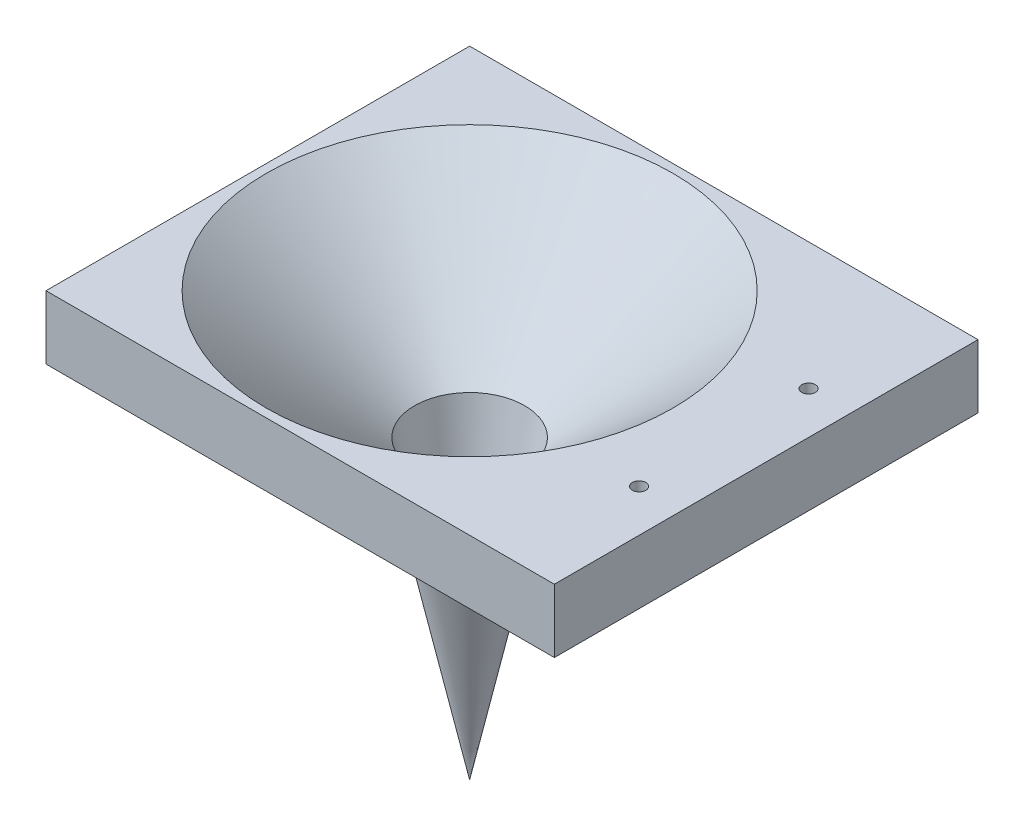
ISO-10303-21;
HEADER;
FILE_DESCRIPTION(('STEP AP214'),'2;1');
FILE_NAME('part.step','',(''),(''),'','','');
FILE_SCHEMA(('AUTOMOTIVE_DESIGN { 1 0 10303 214 1 1 1 1 }'));
ENDSEC;
DATA;
#1=APPLICATION_CONTEXT('core data for automotive mechanical design processes');
#2=APPLICATION_PROTOCOL_DEFINITION('international standard','automotive_design',2000,#1);
#3=PRODUCT_CONTEXT('',#1,'mechanical');
#4=PRODUCT('Part','Part','',(#3));
#5=PRODUCT_RELATED_PRODUCT_CATEGORY('part','',(#4));
#6=PRODUCT_DEFINITION_FORMATION('','',#4);
#7=PRODUCT_DEFINITION_CONTEXT('part definition',#1,'design');
#8=PRODUCT_DEFINITION('design','',#6,#7);
#9=PRODUCT_DEFINITION_SHAPE('','',#8);
#10=(LENGTH_UNIT() NAMED_UNIT(*) SI_UNIT(.MILLI.,.METRE.));
#11=(NAMED_UNIT(*) PLANE_ANGLE_UNIT() SI_UNIT($,.RADIAN.));
#12=(NAMED_UNIT(*) SI_UNIT($,.STERADIAN.) SOLID_ANGLE_UNIT());
#13=UNCERTAINTY_MEASURE_WITH_UNIT(LENGTH_MEASURE(1.E-05),#10,'distance_accuracy_value','');
#14=(GEOMETRIC_REPRESENTATION_CONTEXT(3) GLOBAL_UNCERTAINTY_ASSIGNED_CONTEXT((#13)) GLOBAL_UNIT_ASSIGNED_CONTEXT((#10,
#11,#12)) REPRESENTATION_CONTEXT('',''));
#15=CARTESIAN_POINT('',(0.,0.,0.));
#16=DIRECTION('',(0.,0.,1.));
#17=DIRECTION('',(1.,0.,0.));
#18=AXIS2_PLACEMENT_3D('',#15,#16,#17);
#19=CARTESIAN_POINT('',(0.,14.6761992917921,0.));
#20=DIRECTION('',(0.,1.,0.));
#21=DIRECTION('',(0.,0.,1.));
#22=AXIS2_PLACEMENT_3D('',#19,#20,#21);
#23=CONICAL_SURFACE('',#22,13.,0.862170054667226);
#24=CARTESIAN_POINT('',(0.,44.6761992917921,0.));
#25=DIRECTION('',(0.,-1.,0.));
#26=DIRECTION('',(0.,0.,-1.));
#27=AXIS2_PLACEMENT_3D('',#24,#25,#26);
#28=CIRCLE('',#27,48.);
#29=CARTESIAN_POINT('',(0.,44.6761992917921,48.));
#30=VERTEX_POINT('',#29);
#31=EDGE_CURVE('E124',#30,#30,#28,.T.);
#32=CARTESIAN_POINT('',(0.,14.6761992917921,0.));
#33=DIRECTION('',(0.,-1.,0.));
#34=DIRECTION('',(0.,0.,-1.));
#35=AXIS2_PLACEMENT_3D('',#32,#33,#34);
#36=CIRCLE('',#35,13.);
#37=CARTESIAN_POINT('',(0.,14.6761992917921,13.));
#38=VERTEX_POINT('',#37);
#39=EDGE_CURVE('E11',#38,#38,#36,.T.);
#40=CARTESIAN_POINT('',(0.,44.6761992917921,48.));
#41=CARTESIAN_POINT('',(0.,44.3636992917921,47.6354166666667));
#42=CARTESIAN_POINT('',(0.,44.0511992917921,47.2708333333333));
#43=CARTESIAN_POINT('',(0.,43.4261992917921,46.5416666666667));
#44=CARTESIAN_POINT('',(0.,43.1136992917921,46.1770833333333));
#45=CARTESIAN_POINT('',(0.,42.4886992917921,45.4479166666667));
#46=CARTESIAN_POINT('',(0.,42.1761992917921,45.0833333333333));
#47=CARTESIAN_POINT('',(0.,41.5511992917921,44.3541666666667));
#48=CARTESIAN_POINT('',(0.,41.2386992917921,43.9895833333333));
#49=CARTESIAN_POINT('',(0.,40.6136992917921,43.2604166666667));
#50=CARTESIAN_POINT('',(0.,40.3011992917921,42.8958333333333));
#51=CARTESIAN_POINT('',(0.,39.6761992917921,42.1666666666667));
#52=CARTESIAN_POINT('',(0.,39.3636992917921,41.8020833333333));
#53=CARTESIAN_POINT('',(0.,38.7386992917921,41.0729166666667));
#54=CARTESIAN_POINT('',(0.,38.4261992917921,40.7083333333333));
#55=CARTESIAN_POINT('',(0.,37.8011992917921,39.9791666666667));
#56=CARTESIAN_POINT('',(0.,37.4886992917921,39.6145833333333));
#57=CARTESIAN_POINT('',(0.,36.8636992917921,38.8854166666667));
#58=CARTESIAN_POINT('',(0.,36.5511992917921,38.5208333333333));
#59=CARTESIAN_POINT('',(0.,35.9261992917921,37.7916666666667));
#60=CARTESIAN_POINT('',(0.,35.6136992917921,37.4270833333333));
#61=CARTESIAN_POINT('',(0.,34.9886992917921,36.6979166666667));
#62=CARTESIAN_POINT('',(0.,34.6761992917921,36.3333333333333));
#63=CARTESIAN_POINT('',(0.,34.0511992917921,35.6041666666667));
#64=CARTESIAN_POINT('',(0.,33.7386992917921,35.2395833333333));
#65=CARTESIAN_POINT('',(0.,33.1136992917921,34.5104166666667));
#66=CARTESIAN_POINT('',(0.,32.8011992917921,34.1458333333333));
#67=CARTESIAN_POINT('',(0.,32.1761992917921,33.4166666666667));
#68=CARTESIAN_POINT('',(0.,31.8636992917921,33.0520833333333));
#69=CARTESIAN_POINT('',(0.,31.2386992917921,32.3229166666667));
#70=CARTESIAN_POINT('',(0.,30.9261992917921,31.9583333333333));
#71=CARTESIAN_POINT('',(0.,30.3011992917921,31.2291666666667));
#72=CARTESIAN_POINT('',(0.,29.9886992917921,30.8645833333333));
#73=CARTESIAN_POINT('',(0.,29.3636992917921,30.1354166666667));
#74=CARTESIAN_POINT('',(0.,29.0511992917921,29.7708333333333));
#75=CARTESIAN_POINT('',(0.,28.4261992917921,29.0416666666667));
#76=CARTESIAN_POINT('',(0.,28.1136992917921,28.6770833333333));
#77=CARTESIAN_POINT('',(0.,27.4886992917921,27.9479166666667));
#78=CARTESIAN_POINT('',(0.,27.1761992917921,27.5833333333333));
#79=CARTESIAN_POINT('',(0.,26.5511992917921,26.8541666666667));
#80=CARTESIAN_POINT('',(0.,26.2386992917921,26.4895833333333));
#81=CARTESIAN_POINT('',(0.,25.6136992917921,25.7604166666667));
#82=CARTESIAN_POINT('',(0.,25.3011992917921,25.3958333333333));
#83=CARTESIAN_POINT('',(0.,24.6761992917921,24.6666666666667));
#84=CARTESIAN_POINT('',(0.,24.3636992917921,24.3020833333333));
#85=CARTESIAN_POINT('',(0.,23.7386992917921,23.5729166666667));
#86=CARTESIAN_POINT('',(0.,23.4261992917921,23.2083333333333));
#87=CARTESIAN_POINT('',(0.,22.8011992917921,22.4791666666667));
#88=CARTESIAN_POINT('',(0.,22.4886992917921,22.1145833333333));
#89=CARTESIAN_POINT('',(0.,21.8636992917921,21.3854166666667));
#90=CARTESIAN_POINT('',(0.,21.5511992917921,21.0208333333333));
#91=CARTESIAN_POINT('',(0.,20.9261992917921,20.2916666666667));
#92=CARTESIAN_POINT('',(0.,20.6136992917921,19.9270833333333));
#93=CARTESIAN_POINT('',(0.,19.9886992917921,19.1979166666667));
#94=CARTESIAN_POINT('',(0.,19.6761992917921,18.8333333333333));
#95=CARTESIAN_POINT('',(0.,19.0511992917921,18.1041666666667));
#96=CARTESIAN_POINT('',(0.,18.7386992917921,17.7395833333333));
#97=CARTESIAN_POINT('',(0.,18.1136992917921,17.0104166666667));
#98=CARTESIAN_POINT('',(0.,17.8011992917921,16.6458333333333));
#99=CARTESIAN_POINT('',(0.,17.1761992917921,15.9166666666667));
#100=CARTESIAN_POINT('',(0.,16.8636992917921,15.5520833333333));
#101=CARTESIAN_POINT('',(0.,16.2386992917921,14.8229166666667));
#102=CARTESIAN_POINT('',(0.,15.9261992917921,14.4583333333333));
#103=CARTESIAN_POINT('',(0.,15.3011992917921,13.7291666666667));
#104=CARTESIAN_POINT('',(0.,14.9886992917921,13.3645833333333));
#105=CARTESIAN_POINT('',(0.,14.6761992917921,13.));
#106=B_SPLINE_CURVE_WITH_KNOTS('',3,(#40,#41,#42,#43,#44,#45,#46,#47,#48,#49,#50,#51,#52,#53,
#54,#55,#56,#57,#58,#59,#60,#61,#62,#63,#64,#65,#66,#67,#68,#69,#70,#71,#72,#73,#74,#75,#76,#77,
#78,#79,#80,#81,#82,#83,#84,#85,#86,#87,#88,#89,#90,#91,#92,#93,#94,#95,#96,#97,#98,#99,#100,
#101,#102,#103,#104,#105),.UNSPECIFIED.,.F.,.F.,(4,2,2,2,2,2,2,2,2,2,2,2,2,2,2,2,2,2,2,2,2,2,2,
2,2,2,2,2,2,2,2,2,4),(0.,1.44055382145202,2.88110764290403,4.32166146435604,5.76221528580806,
7.20276910726006,8.64332292871208,10.0838767501641,11.5244305716161,12.9649843930681,
14.4055382145201,15.8460920359721,17.2866458574242,18.7271996788762,20.1677535003282,
21.6083073217802,23.0488611432322,24.4894149646842,25.9299687861362,27.3705226075883,
28.8110764290403,30.2516302504923,31.6921840719443,33.1327378933963,34.5732917148483,
36.0138455363003,37.4543993577524,38.8949531792044,40.3355070006564,41.7760608221084,
43.2166146435604,44.6571684650124,46.0977222864644),.UNSPECIFIED.);
#107=EDGE_CURVE('BSEAM47',#30,#38,#106,.T.);
#108=ORIENTED_EDGE('',*,*,#31,.F.);
#109=ORIENTED_EDGE('',*,*,#39,.T.);
#110=ORIENTED_EDGE('',*,*,#107,.T.);
#111=ORIENTED_EDGE('',*,*,#107,.F.);
#112=EDGE_LOOP('',(#108,#110,#109,#111));
#113=FACE_BOUND('',#112,.T.);
#114=ADVANCED_FACE('F47',(#113),#23,.F.);
#115=CARTESIAN_POINT('',(0.,-53.3238007082079,0.));
#116=DIRECTION('',(0.,1.,0.));
#117=DIRECTION('',(0.,0.,1.));
#118=AXIS2_PLACEMENT_3D('',#115,#116,#117);
#119=CONICAL_SURFACE('',#118,0.,0.188897180877623);
#120=ORIENTED_EDGE('',*,*,#39,.F.);
#121=EDGE_LOOP('',(#120));
#122=FACE_BOUND('',#121,.T.);
#123=CARTESIAN_POINT('',(0.,-53.3238007082079,0.));
#124=VERTEX_POINT('',#123);
#125=VERTEX_LOOP('',#124);
#126=FACE_BOUND('',#125,.T.);
#127=ADVANCED_FACE('F194',(#122,#126),#119,.F.);
#128=CARTESIAN_POINT('',(-3.10003406915555E-13,44.6761992917921,0.));
#129=DIRECTION('',(0.,-1.,0.));
#130=DIRECTION('',(0.,0.,-1.));
#131=AXIS2_PLACEMENT_3D('',#128,#129,#130);
#132=PLANE('',#131);
#133=CARTESIAN_POINT('',(60.,44.6761992917921,-20.));
#134=DIRECTION('',(0.,1.,0.));
#135=DIRECTION('',(0.,0.,1.));
#136=AXIS2_PLACEMENT_3D('',#133,#134,#135);
#137=CIRCLE('',#136,1.6);
#138=CARTESIAN_POINT('',(60.,44.6761992917921,-18.4));
#139=VERTEX_POINT('',#138);
#140=EDGE_CURVE('E138',#139,#139,#137,.T.);
#141=ORIENTED_EDGE('',*,*,#140,.F.);
#142=EDGE_LOOP('',(#141));
#143=FACE_BOUND('',#142,.T.);
#144=CARTESIAN_POINT('',(60.,44.6761992917921,20.));
#145=DIRECTION('',(0.,1.,0.));
#146=DIRECTION('',(0.,0.,1.));
#147=AXIS2_PLACEMENT_3D('',#144,#145,#146);
#148=CIRCLE('',#147,1.6);
#149=CARTESIAN_POINT('',(60.,44.6761992917921,21.6));
#150=VERTEX_POINT('',#149);
#151=EDGE_CURVE('E145',#150,#150,#148,.T.);
#152=ORIENTED_EDGE('',*,*,#151,.F.);
#153=EDGE_LOOP('',(#152));
#154=FACE_BOUND('',#153,.T.);
#155=DIRECTION('',(0.,0.,-1.));
#156=VECTOR('',#155,1.);
#157=CARTESIAN_POINT('',(70.,44.6761992917921,50.));
#158=LINE('',#157,#156);
#159=CARTESIAN_POINT('',(70.,44.6761992917921,50.));
#160=VERTEX_POINT('',#159);
#161=CARTESIAN_POINT('',(70.,44.6761992917921,-50.));
#162=VERTEX_POINT('',#161);
#163=EDGE_CURVE('E117',#160,#162,#158,.T.);
#164=ORIENTED_EDGE('',*,*,#163,.T.);
#165=DIRECTION('',(1.,0.,0.));
#166=VECTOR('',#165,1.);
#167=CARTESIAN_POINT('',(-50.001,44.6761992917921,-50.));
#168=LINE('',#167,#166);
#169=CARTESIAN_POINT('',(-50.001,44.6761992917921,-50.));
#170=VERTEX_POINT('',#169);
#171=EDGE_CURVE('E94',#170,#162,#168,.T.);
#172=ORIENTED_EDGE('',*,*,#171,.F.);
#173=DIRECTION('',(0.,0.,-1.));
#174=VECTOR('',#173,1.);
#175=CARTESIAN_POINT('',(-50.001,44.6761992917921,50.));
#176=LINE('',#175,#174);
#177=CARTESIAN_POINT('',(-50.001,44.6761992917921,50.));
#178=VERTEX_POINT('',#177);
#179=EDGE_CURVE('E102',#178,#170,#176,.T.);
#180=ORIENTED_EDGE('',*,*,#179,.F.);
#181=DIRECTION('',(1.,0.,0.));
#182=VECTOR('',#181,1.);
#183=CARTESIAN_POINT('',(-50.001,44.6761992917921,50.));
#184=LINE('',#183,#182);
#185=EDGE_CURVE('E157',#178,#160,#184,.T.);
#186=ORIENTED_EDGE('',*,*,#185,.T.);
#187=EDGE_LOOP('',(#164,#172,#180,#186));
#188=FACE_BOUND('',#187,.T.);
#189=ORIENTED_EDGE('',*,*,#31,.T.);
#190=EDGE_LOOP('',(#189));
#191=FACE_BOUND('',#190,.T.);
#192=ADVANCED_FACE('F114',(#143,#154,#188,#191),#132,.F.);
#193=CARTESIAN_POINT('',(-50.001,29.6761992917921,50.));
#194=DIRECTION('',(0.,-1.,0.));
#195=DIRECTION('',(0.,0.,-1.));
#196=AXIS2_PLACEMENT_3D('',#193,#194,#195);
#197=PLANE('',#196);
#198=CARTESIAN_POINT('',(60.,29.6761992917921,-20.));
#199=DIRECTION('',(0.,-1.,0.));
#200=DIRECTION('',(0.,0.,-1.));
#201=AXIS2_PLACEMENT_3D('',#198,#199,#200);
#202=CIRCLE('',#201,1.6);
#203=CARTESIAN_POINT('',(60.,29.6761992917921,-21.6));
#204=VERTEX_POINT('',#203);
#205=EDGE_CURVE('E50',#204,#204,#202,.T.);
#206=ORIENTED_EDGE('',*,*,#205,.F.);
#207=EDGE_LOOP('',(#206));
#208=FACE_BOUND('',#207,.T.);
#209=CARTESIAN_POINT('',(60.,29.6761992917921,20.));
#210=DIRECTION('',(0.,-1.,0.));
#211=DIRECTION('',(0.,0.,-1.));
#212=AXIS2_PLACEMENT_3D('',#209,#210,#211);
#213=CIRCLE('',#212,1.6);
#214=CARTESIAN_POINT('',(60.,29.6761992917921,18.4));
#215=VERTEX_POINT('',#214);
#216=EDGE_CURVE('E135',#215,#215,#213,.T.);
#217=ORIENTED_EDGE('',*,*,#216,.F.);
#218=EDGE_LOOP('',(#217));
#219=FACE_BOUND('',#218,.T.);
#220=DIRECTION('',(0.,0.,-1.));
#221=VECTOR('',#220,1.);
#222=CARTESIAN_POINT('',(70.,29.6761992917921,50.));
#223=LINE('',#222,#221);
#224=CARTESIAN_POINT('',(70.,29.6761992917921,50.));
#225=VERTEX_POINT('',#224);
#226=CARTESIAN_POINT('',(70.,29.6761992917921,-50.));
#227=VERTEX_POINT('',#226);
#228=EDGE_CURVE('E163',#225,#227,#223,.T.);
#229=ORIENTED_EDGE('',*,*,#228,.F.);
#230=DIRECTION('',(1.,0.,0.));
#231=VECTOR('',#230,1.);
#232=CARTESIAN_POINT('',(-50.001,29.6761992917921,50.));
#233=LINE('',#232,#231);
#234=CARTESIAN_POINT('',(-50.001,29.6761992917921,50.));
#235=VERTEX_POINT('',#234);
#236=EDGE_CURVE('E126',#235,#225,#233,.T.);
#237=ORIENTED_EDGE('',*,*,#236,.F.);
#238=DIRECTION('',(0.,0.,-1.));
#239=VECTOR('',#238,1.);
#240=CARTESIAN_POINT('',(-50.001,29.6761992917921,50.));
#241=LINE('',#240,#239);
#242=CARTESIAN_POINT('',(-50.001,29.6761992917921,-50.));
#243=VERTEX_POINT('',#242);
#244=EDGE_CURVE('E101',#235,#243,#241,.T.);
#245=ORIENTED_EDGE('',*,*,#244,.T.);
#246=DIRECTION('',(1.,0.,0.));
#247=VECTOR('',#246,1.);
#248=CARTESIAN_POINT('',(-50.001,29.6761992917921,-50.));
#249=LINE('',#248,#247);
#250=EDGE_CURVE('E96',#243,#227,#249,.T.);
#251=ORIENTED_EDGE('',*,*,#250,.T.);
#252=EDGE_LOOP('',(#229,#237,#245,#251));
#253=FACE_BOUND('',#252,.T.);
#254=CARTESIAN_POINT('',(0.,29.6761992917921,0.));
#255=DIRECTION('',(0.,-1.,0.));
#256=DIRECTION('',(0.,0.,-1.));
#257=AXIS2_PLACEMENT_3D('',#254,#255,#256);
#258=CIRCLE('',#257,32.5);
#259=CARTESIAN_POINT('',(0.,29.6761992917921,-32.5));
#260=VERTEX_POINT('',#259);
#261=EDGE_CURVE('E119',#260,#260,#258,.F.);
#262=ORIENTED_EDGE('',*,*,#261,.T.);
#263=EDGE_LOOP('',(#262));
#264=FACE_BOUND('',#263,.T.);
#265=ADVANCED_FACE('F177',(#208,#219,#253,#264),#197,.T.);
#266=CARTESIAN_POINT('',(-50.001,44.6761992917921,-50.));
#267=DIRECTION('',(0.,0.,1.));
#268=DIRECTION('',(1.,0.,0.));
#269=AXIS2_PLACEMENT_3D('',#266,#267,#268);
#270=PLANE('',#269);
#271=DIRECTION('',(0.,-1.,0.));
#272=VECTOR('',#271,1.);
#273=CARTESIAN_POINT('',(70.,44.6761992917921,-50.));
#274=LINE('',#273,#272);
#275=EDGE_CURVE('E160',#162,#227,#274,.T.);
#276=ORIENTED_EDGE('',*,*,#275,.T.);
#277=ORIENTED_EDGE('',*,*,#250,.F.);
#278=DIRECTION('',(0.,-1.,0.));
#279=VECTOR('',#278,1.);
#280=CARTESIAN_POINT('',(-50.001,44.6761992917921,-50.));
#281=LINE('',#280,#279);
#282=EDGE_CURVE('E89',#170,#243,#281,.T.);
#283=ORIENTED_EDGE('',*,*,#282,.F.);
#284=ORIENTED_EDGE('',*,*,#171,.T.);
#285=EDGE_LOOP('',(#276,#277,#283,#284));
#286=FACE_BOUND('',#285,.T.);
#287=ADVANCED_FACE('F92',(#286),#270,.F.);
#288=CARTESIAN_POINT('',(-50.001,44.6761992917921,50.));
#289=DIRECTION('',(0.,0.,1.));
#290=DIRECTION('',(1.,0.,0.));
#291=AXIS2_PLACEMENT_3D('',#288,#289,#290);
#292=PLANE('',#291);
#293=DIRECTION('',(0.,-1.,0.));
#294=VECTOR('',#293,1.);
#295=CARTESIAN_POINT('',(70.,44.6761992917921,50.));
#296=LINE('',#295,#294);
#297=EDGE_CURVE('E111',#160,#225,#296,.T.);
#298=ORIENTED_EDGE('',*,*,#297,.F.);
#299=ORIENTED_EDGE('',*,*,#185,.F.);
#300=DIRECTION('',(0.,-1.,0.));
#301=VECTOR('',#300,1.);
#302=CARTESIAN_POINT('',(-50.001,44.6761992917921,50.));
#303=LINE('',#302,#301);
#304=EDGE_CURVE('E108',#178,#235,#303,.T.);
#305=ORIENTED_EDGE('',*,*,#304,.T.);
#306=ORIENTED_EDGE('',*,*,#236,.T.);
#307=EDGE_LOOP('',(#298,#299,#305,#306));
#308=FACE_BOUND('',#307,.T.);
#309=ADVANCED_FACE('F175',(#308),#292,.T.);
#310=CARTESIAN_POINT('',(-50.001,0.,0.));
#311=DIRECTION('',(-1.,0.,0.));
#312=DIRECTION('',(0.,0.,1.));
#313=AXIS2_PLACEMENT_3D('',#310,#311,#312);
#314=PLANE('',#313);
#315=ORIENTED_EDGE('',*,*,#179,.T.);
#316=ORIENTED_EDGE('',*,*,#282,.T.);
#317=ORIENTED_EDGE('',*,*,#244,.F.);
#318=ORIENTED_EDGE('',*,*,#304,.F.);
#319=EDGE_LOOP('',(#315,#316,#317,#318));
#320=FACE_BOUND('',#319,.T.);
#321=ADVANCED_FACE('F106',(#320),#314,.T.);
#322=CARTESIAN_POINT('',(70.,0.,0.));
#323=DIRECTION('',(-1.,0.,0.));
#324=DIRECTION('',(0.,0.,1.));
#325=AXIS2_PLACEMENT_3D('',#322,#323,#324);
#326=PLANE('',#325);
#327=ORIENTED_EDGE('',*,*,#163,.F.);
#328=ORIENTED_EDGE('',*,*,#297,.T.);
#329=ORIENTED_EDGE('',*,*,#228,.T.);
#330=ORIENTED_EDGE('',*,*,#275,.F.);
#331=EDGE_LOOP('',(#327,#328,#329,#330));
#332=FACE_BOUND('',#331,.T.);
#333=ADVANCED_FACE('F180',(#332),#326,.F.);
#334=CARTESIAN_POINT('',(0.,14.6761992917921,0.));
#335=DIRECTION('',(0.,1.,0.));
#336=DIRECTION('',(0.,0.,1.));
#337=AXIS2_PLACEMENT_3D('',#334,#335,#336);
#338=CONICAL_SURFACE('',#337,15.,0.211093333222747);
#339=CARTESIAN_POINT('',(0.,-55.3238007082079,0.));
#340=VERTEX_POINT('',#339);
#341=VERTEX_LOOP('',#340);
#342=FACE_BOUND('',#341,.T.);
#343=CARTESIAN_POINT('',(0.,14.6761992917921,0.));
#344=DIRECTION('',(0.,-1.,0.));
#345=DIRECTION('',(0.,0.,-1.));
#346=AXIS2_PLACEMENT_3D('',#343,#344,#345);
#347=CIRCLE('',#346,15.);
#348=CARTESIAN_POINT('',(0.,14.6761992917921,-15.));
#349=VERTEX_POINT('',#348);
#350=EDGE_CURVE('E56',#349,#349,#347,.T.);
#351=ORIENTED_EDGE('',*,*,#350,.T.);
#352=EDGE_LOOP('',(#351));
#353=FACE_BOUND('',#352,.T.);
#354=ADVANCED_FACE('F182',(#342,#353),#338,.T.);
#355=CARTESIAN_POINT('',(0.,44.6761992917921,0.));
#356=DIRECTION('',(0.,1.,0.));
#357=DIRECTION('',(0.,0.,1.));
#358=AXIS2_PLACEMENT_3D('',#355,#356,#357);
#359=CONICAL_SURFACE('',#358,50.,0.862170054667226);
#360=ORIENTED_EDGE('',*,*,#261,.F.);
#361=EDGE_LOOP('',(#360));
#362=FACE_BOUND('',#361,.T.);
#363=ORIENTED_EDGE('',*,*,#350,.F.);
#364=EDGE_LOOP('',(#363));
#365=FACE_BOUND('',#364,.T.);
#366=ADVANCED_FACE('F189',(#362,#365),#359,.T.);
#367=CARTESIAN_POINT('',(60.,-55.3238007082079,20.));
#368=DIRECTION('',(0.,1.,0.));
#369=DIRECTION('',(0.,0.,1.));
#370=AXIS2_PLACEMENT_3D('',#367,#368,#369);
#371=CYLINDRICAL_SURFACE('',#370,1.6);
#372=ORIENTED_EDGE('',*,*,#216,.T.);
#373=EDGE_LOOP('',(#372));
#374=FACE_BOUND('',#373,.T.);
#375=ORIENTED_EDGE('',*,*,#151,.T.);
#376=EDGE_LOOP('',(#375));
#377=FACE_BOUND('',#376,.T.);
#378=ADVANCED_FACE('F214',(#374,#377),#371,.F.);
#379=CARTESIAN_POINT('',(60.,-55.3238007082079,-20.));
#380=DIRECTION('',(0.,1.,0.));
#381=DIRECTION('',(0.,0.,1.));
#382=AXIS2_PLACEMENT_3D('',#379,#380,#381);
#383=CYLINDRICAL_SURFACE('',#382,1.6);
#384=ORIENTED_EDGE('',*,*,#205,.T.);
#385=EDGE_LOOP('',(#384));
#386=FACE_BOUND('',#385,.T.);
#387=ORIENTED_EDGE('',*,*,#140,.T.);
#388=EDGE_LOOP('',(#387));
#389=FACE_BOUND('',#388,.T.);
#390=ADVANCED_FACE('F219',(#386,#389),#383,.F.);
#391=CLOSED_SHELL('',(#114,#127,#192,#265,#287,#309,#321,#333,#354,#366,#378,#390));
#392=MANIFOLD_SOLID_BREP('B2',#391);
#393=ADVANCED_BREP_SHAPE_REPRESENTATION('',(#18,#392),#14);
#394=SHAPE_DEFINITION_REPRESENTATION(#9,#393);
ENDSEC;
END-ISO-10303-21;
